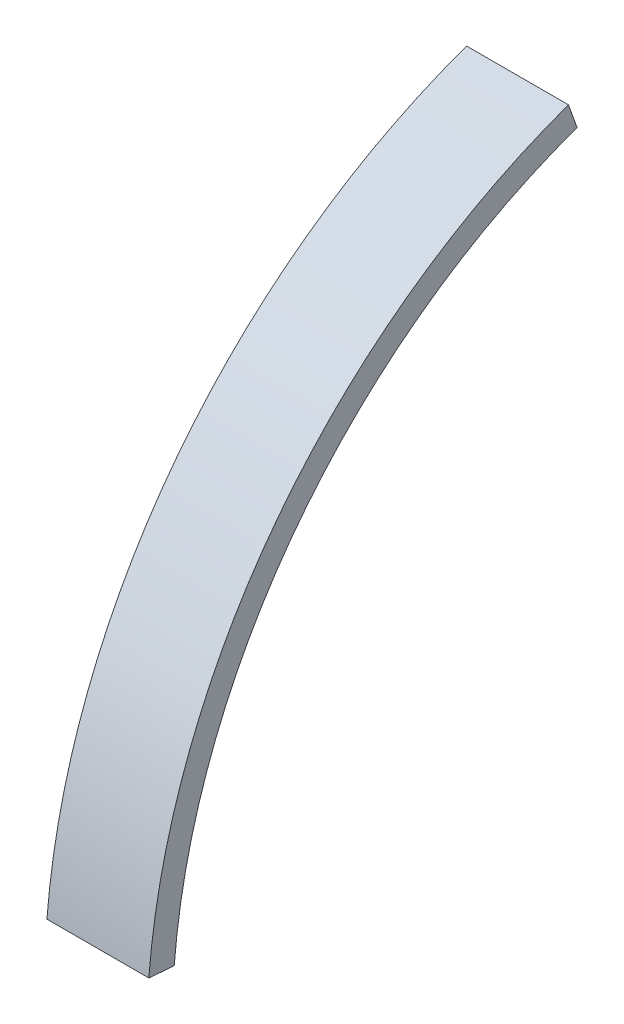
ISO-10303-21;
HEADER;
FILE_DESCRIPTION(('STEP AP214'),'2;1');
FILE_NAME('part.step','',(''),(''),'','','');
FILE_SCHEMA(('AUTOMOTIVE_DESIGN { 1 0 10303 214 1 1 1 1 }'));
ENDSEC;
DATA;
#1=APPLICATION_CONTEXT('core data for automotive mechanical design processes');
#2=APPLICATION_PROTOCOL_DEFINITION('international standard','automotive_design',2000,#1);
#3=PRODUCT_CONTEXT('',#1,'mechanical');
#4=PRODUCT('Part','Part','',(#3));
#5=PRODUCT_RELATED_PRODUCT_CATEGORY('part','',(#4));
#6=PRODUCT_DEFINITION_FORMATION('','',#4);
#7=PRODUCT_DEFINITION_CONTEXT('part definition',#1,'design');
#8=PRODUCT_DEFINITION('design','',#6,#7);
#9=PRODUCT_DEFINITION_SHAPE('','',#8);
#10=(LENGTH_UNIT() NAMED_UNIT(*) SI_UNIT(.MILLI.,.METRE.));
#11=(NAMED_UNIT(*) PLANE_ANGLE_UNIT() SI_UNIT($,.RADIAN.));
#12=(NAMED_UNIT(*) SI_UNIT($,.STERADIAN.) SOLID_ANGLE_UNIT());
#13=UNCERTAINTY_MEASURE_WITH_UNIT(LENGTH_MEASURE(1.E-05),#10,'distance_accuracy_value','');
#14=(GEOMETRIC_REPRESENTATION_CONTEXT(3) GLOBAL_UNCERTAINTY_ASSIGNED_CONTEXT((#13)) GLOBAL_UNIT_ASSIGNED_CONTEXT((#10,
#11,#12)) REPRESENTATION_CONTEXT('',''));
#15=CARTESIAN_POINT('',(0.,0.,0.));
#16=DIRECTION('',(0.,0.,1.));
#17=DIRECTION('',(1.,0.,0.));
#18=AXIS2_PLACEMENT_3D('',#15,#16,#17);
#19=CARTESIAN_POINT('',(6.35,0.,-76.2));
#20=DIRECTION('',(-1.,0.,0.));
#21=DIRECTION('',(0.,0.,1.));
#22=AXIS2_PLACEMENT_3D('',#19,#20,#21);
#23=CYLINDRICAL_SURFACE('',#22,79.375);
#24=CARTESIAN_POINT('',(-6.35,0.,-76.2));
#25=DIRECTION('',(1.,0.,0.));
#26=DIRECTION('',(0.,0.,-1.));
#27=AXIS2_PLACEMENT_3D('',#24,#25,#26);
#28=CIRCLE('',#27,79.375);
#29=CARTESIAN_POINT('',(-6.35,74.7183333333333,-49.4126655135512));
#30=VERTEX_POINT('',#29);
#31=CARTESIAN_POINT('',(-6.35,6.61458333333334,2.89891220697278));
#32=VERTEX_POINT('',#31);
#33=EDGE_CURVE('E102',#30,#32,#28,.T.);
#34=ORIENTED_EDGE('',*,*,#33,.T.);
#35=DIRECTION('',(-1.,0.,0.));
#36=VECTOR('',#35,1.);
#37=CARTESIAN_POINT('',(6.35,6.61458333333334,2.89891220697278));
#38=LINE('',#37,#36);
#39=CARTESIAN_POINT('',(6.35,6.61458333333334,2.89891220697278));
#40=VERTEX_POINT('',#39);
#41=EDGE_CURVE('E11',#40,#32,#38,.T.);
#42=ORIENTED_EDGE('',*,*,#41,.F.);
#43=CARTESIAN_POINT('',(6.35,0.,-76.2));
#44=DIRECTION('',(1.,0.,0.));
#45=DIRECTION('',(0.,0.,-1.));
#46=AXIS2_PLACEMENT_3D('',#43,#44,#45);
#47=CIRCLE('',#46,79.375);
#48=CARTESIAN_POINT('',(6.35,74.7183333333333,-49.4126655135512));
#49=VERTEX_POINT('',#48);
#50=EDGE_CURVE('E79',#49,#40,#47,.T.);
#51=ORIENTED_EDGE('',*,*,#50,.F.);
#52=DIRECTION('',(-1.,0.,0.));
#53=VECTOR('',#52,1.);
#54=CARTESIAN_POINT('',(6.35,74.7183333333333,-49.4126655135512));
#55=LINE('',#54,#53);
#56=EDGE_CURVE('E55',#49,#30,#55,.T.);
#57=ORIENTED_EDGE('',*,*,#56,.T.);
#58=EDGE_LOOP('',(#34,#42,#51,#57));
#59=FACE_BOUND('',#58,.T.);
#60=ADVANCED_FACE('F39',(#59),#23,.T.);
#61=CARTESIAN_POINT('',(6.35,6.35,-0.265044281306123));
#62=DIRECTION('',(0.,-0.996521728591783,0.083333333333337));
#63=DIRECTION('',(0.,-0.083333333333337,-0.996521728591783));
#64=AXIS2_PLACEMENT_3D('',#61,#62,#63);
#65=PLANE('',#64);
#66=DIRECTION('',(0.,0.083333333333337,0.996521728591783));
#67=VECTOR('',#66,1.);
#68=CARTESIAN_POINT('',(-6.35,6.35,-0.265044281306123));
#69=LINE('',#68,#67);
#70=CARTESIAN_POINT('',(-6.35,6.35,-0.265044281306123));
#71=VERTEX_POINT('',#70);
#72=EDGE_CURVE('E88',#71,#32,#69,.T.);
#73=ORIENTED_EDGE('',*,*,#72,.F.);
#74=DIRECTION('',(-1.,0.,0.));
#75=VECTOR('',#74,1.);
#76=CARTESIAN_POINT('',(6.35,6.35,-0.265044281306123));
#77=LINE('',#76,#75);
#78=CARTESIAN_POINT('',(6.35,6.35,-0.265044281306123));
#79=VERTEX_POINT('',#78);
#80=EDGE_CURVE('E47',#79,#71,#77,.T.);
#81=ORIENTED_EDGE('',*,*,#80,.F.);
#82=DIRECTION('',(0.,0.083333333333337,0.996521728591783));
#83=VECTOR('',#82,1.);
#84=CARTESIAN_POINT('',(6.35,6.35,-0.265044281306123));
#85=LINE('',#84,#83);
#86=EDGE_CURVE('E86',#79,#40,#85,.T.);
#87=ORIENTED_EDGE('',*,*,#86,.T.);
#88=ORIENTED_EDGE('',*,*,#41,.T.);
#89=EDGE_LOOP('',(#73,#81,#87,#88));
#90=FACE_BOUND('',#89,.T.);
#91=ADVANCED_FACE('F85',(#90),#65,.T.);
#92=CARTESIAN_POINT('',(6.35,0.,-76.2));
#93=DIRECTION('',(-1.,0.,0.));
#94=DIRECTION('',(0.,0.,1.));
#95=AXIS2_PLACEMENT_3D('',#92,#93,#94);
#96=CYLINDRICAL_SURFACE('',#95,76.2);
#97=CARTESIAN_POINT('',(-6.35,0.,-76.2));
#98=DIRECTION('',(1.,0.,0.));
#99=DIRECTION('',(0.,0.,1.));
#100=AXIS2_PLACEMENT_3D('',#97,#98,#99);
#101=CIRCLE('',#100,76.2);
#102=CARTESIAN_POINT('',(-6.35,71.7296,-50.4841588930091));
#103=VERTEX_POINT('',#102);
#104=EDGE_CURVE('E105',#103,#71,#101,.T.);
#105=ORIENTED_EDGE('',*,*,#104,.F.);
#106=DIRECTION('',(-1.,0.,0.));
#107=VECTOR('',#106,1.);
#108=CARTESIAN_POINT('',(6.35,71.7296,-50.4841588930091));
#109=LINE('',#108,#107);
#110=CARTESIAN_POINT('',(6.35,71.7296,-50.4841588930091));
#111=VERTEX_POINT('',#110);
#112=EDGE_CURVE('E68',#111,#103,#109,.T.);
#113=ORIENTED_EDGE('',*,*,#112,.F.);
#114=CARTESIAN_POINT('',(6.35,0.,-76.2));
#115=DIRECTION('',(1.,0.,0.));
#116=DIRECTION('',(0.,0.,1.));
#117=AXIS2_PLACEMENT_3D('',#114,#115,#116);
#118=CIRCLE('',#117,76.2);
#119=EDGE_CURVE('E94',#111,#79,#118,.T.);
#120=ORIENTED_EDGE('',*,*,#119,.T.);
#121=ORIENTED_EDGE('',*,*,#80,.T.);
#122=EDGE_LOOP('',(#105,#113,#120,#121));
#123=FACE_BOUND('',#122,.T.);
#124=ADVANCED_FACE('F96',(#123),#96,.F.);
#125=CARTESIAN_POINT('',(6.35,74.7183333333333,-49.4126655135512));
#126=DIRECTION('',(0.,0.337478229750538,-0.941333333333332));
#127=DIRECTION('',(0.,0.941333333333333,0.337478229750538));
#128=AXIS2_PLACEMENT_3D('',#125,#126,#127);
#129=PLANE('',#128);
#130=DIRECTION('',(0.,-0.941333333333333,-0.337478229750538));
#131=VECTOR('',#130,1.);
#132=CARTESIAN_POINT('',(-6.35,74.7183333333333,-49.4126655135512));
#133=LINE('',#132,#131);
#134=EDGE_CURVE('E107',#30,#103,#133,.T.);
#135=ORIENTED_EDGE('',*,*,#134,.F.);
#136=ORIENTED_EDGE('',*,*,#56,.F.);
#137=DIRECTION('',(0.,-0.941333333333333,-0.337478229750538));
#138=VECTOR('',#137,1.);
#139=CARTESIAN_POINT('',(6.35,74.7183333333333,-49.4126655135512));
#140=LINE('',#139,#138);
#141=EDGE_CURVE('E97',#49,#111,#140,.T.);
#142=ORIENTED_EDGE('',*,*,#141,.T.);
#143=ORIENTED_EDGE('',*,*,#112,.T.);
#144=EDGE_LOOP('',(#135,#136,#142,#143));
#145=FACE_BOUND('',#144,.T.);
#146=ADVANCED_FACE('F113',(#145),#129,.T.);
#147=CARTESIAN_POINT('',(6.35,0.,-76.2));
#148=DIRECTION('',(1.,0.,0.));
#149=DIRECTION('',(0.,0.,-1.));
#150=AXIS2_PLACEMENT_3D('',#147,#148,#149);
#151=PLANE('',#150);
#152=ORIENTED_EDGE('',*,*,#50,.T.);
#153=ORIENTED_EDGE('',*,*,#86,.F.);
#154=ORIENTED_EDGE('',*,*,#119,.F.);
#155=ORIENTED_EDGE('',*,*,#141,.F.);
#156=EDGE_LOOP('',(#152,#153,#154,#155));
#157=FACE_BOUND('',#156,.T.);
#158=ADVANCED_FACE('F93',(#157),#151,.T.);
#159=CARTESIAN_POINT('',(-6.35,0.,-76.2));
#160=DIRECTION('',(1.,0.,0.));
#161=DIRECTION('',(0.,0.,-1.));
#162=AXIS2_PLACEMENT_3D('',#159,#160,#161);
#163=PLANE('',#162);
#164=ORIENTED_EDGE('',*,*,#33,.F.);
#165=ORIENTED_EDGE('',*,*,#134,.T.);
#166=ORIENTED_EDGE('',*,*,#104,.T.);
#167=ORIENTED_EDGE('',*,*,#72,.T.);
#168=EDGE_LOOP('',(#164,#165,#166,#167));
#169=FACE_BOUND('',#168,.T.);
#170=ADVANCED_FACE('F112',(#169),#163,.F.);
#171=CLOSED_SHELL('',(#60,#91,#124,#146,#158,#170));
#172=MANIFOLD_SOLID_BREP('B2',#171);
#173=ADVANCED_BREP_SHAPE_REPRESENTATION('',(#18,#172),#14);
#174=SHAPE_DEFINITION_REPRESENTATION(#9,#173);
ENDSEC;
END-ISO-10303-21;
